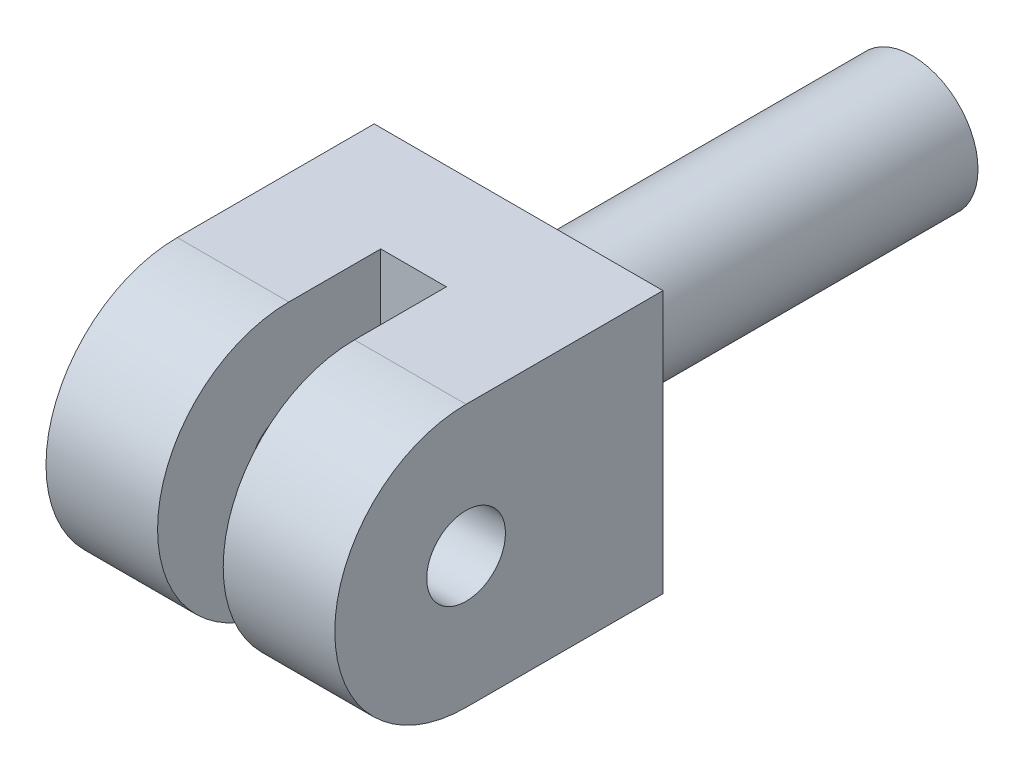
ISO-10303-21;
HEADER;
FILE_DESCRIPTION(('STEP AP214'),'2;1');
FILE_NAME('part.step','',(''),(''),'','','');
FILE_SCHEMA(('AUTOMOTIVE_DESIGN { 1 0 10303 214 1 1 1 1 }'));
ENDSEC;
DATA;
#1=APPLICATION_CONTEXT('core data for automotive mechanical design processes');
#2=APPLICATION_PROTOCOL_DEFINITION('international standard','automotive_design',2000,#1);
#3=PRODUCT_CONTEXT('',#1,'mechanical');
#4=PRODUCT('Part','Part','',(#3));
#5=PRODUCT_RELATED_PRODUCT_CATEGORY('part','',(#4));
#6=PRODUCT_DEFINITION_FORMATION('','',#4);
#7=PRODUCT_DEFINITION_CONTEXT('part definition',#1,'design');
#8=PRODUCT_DEFINITION('design','',#6,#7);
#9=PRODUCT_DEFINITION_SHAPE('','',#8);
#10=(LENGTH_UNIT() NAMED_UNIT(*) SI_UNIT(.MILLI.,.METRE.));
#11=(NAMED_UNIT(*) PLANE_ANGLE_UNIT() SI_UNIT($,.RADIAN.));
#12=(NAMED_UNIT(*) SI_UNIT($,.STERADIAN.) SOLID_ANGLE_UNIT());
#13=UNCERTAINTY_MEASURE_WITH_UNIT(LENGTH_MEASURE(1.E-05),#10,'distance_accuracy_value','');
#14=(GEOMETRIC_REPRESENTATION_CONTEXT(3) GLOBAL_UNCERTAINTY_ASSIGNED_CONTEXT((#13)) GLOBAL_UNIT_ASSIGNED_CONTEXT((#10,
#11,#12)) REPRESENTATION_CONTEXT('',''));
#15=CARTESIAN_POINT('',(0.,0.,0.));
#16=DIRECTION('',(0.,0.,1.));
#17=DIRECTION('',(1.,0.,0.));
#18=AXIS2_PLACEMENT_3D('',#15,#16,#17);
#19=CARTESIAN_POINT('',(0.,10.,-10.));
#20=DIRECTION('',(-1.,0.,0.));
#21=DIRECTION('',(0.,0.,1.));
#22=AXIS2_PLACEMENT_3D('',#19,#20,#21);
#23=CYLINDRICAL_SURFACE('',#22,10.);
#24=CARTESIAN_POINT('',(13.5,10.,-10.));
#25=DIRECTION('',(1.,0.,0.));
#26=DIRECTION('',(0.,0.,-1.));
#27=AXIS2_PLACEMENT_3D('',#24,#25,#26);
#28=CIRCLE('',#27,10.);
#29=CARTESIAN_POINT('',(13.5,0.,-10.));
#30=VERTEX_POINT('',#29);
#31=CARTESIAN_POINT('',(13.5,20.,-10.));
#32=VERTEX_POINT('',#31);
#33=EDGE_CURVE('E133',#30,#32,#28,.F.);
#34=ORIENTED_EDGE('',*,*,#33,.F.);
#35=DIRECTION('',(-1.,0.,0.));
#36=VECTOR('',#35,1.);
#37=CARTESIAN_POINT('',(22.,0.,-10.));
#38=LINE('',#37,#36);
#39=CARTESIAN_POINT('',(22.,0.,-10.));
#40=VERTEX_POINT('',#39);
#41=EDGE_CURVE('E165',#40,#30,#38,.T.);
#42=ORIENTED_EDGE('',*,*,#41,.F.);
#43=CARTESIAN_POINT('',(22.,10.,-10.));
#44=DIRECTION('',(-1.,0.,0.));
#45=DIRECTION('',(0.,0.,1.));
#46=AXIS2_PLACEMENT_3D('',#43,#44,#45);
#47=CIRCLE('',#46,10.);
#48=CARTESIAN_POINT('',(22.,20.,-10.));
#49=VERTEX_POINT('',#48);
#50=EDGE_CURVE('E41',#49,#40,#47,.F.);
#51=ORIENTED_EDGE('',*,*,#50,.F.);
#52=DIRECTION('',(-1.,0.,0.));
#53=VECTOR('',#52,1.);
#54=CARTESIAN_POINT('',(22.,20.,-10.));
#55=LINE('',#54,#53);
#56=EDGE_CURVE('E162',#32,#49,#55,.F.);
#57=ORIENTED_EDGE('',*,*,#56,.F.);
#58=EDGE_LOOP('',(#34,#42,#51,#57));
#59=FACE_BOUND('',#58,.T.);
#60=ADVANCED_FACE('F32',(#59),#23,.T.);
#61=CARTESIAN_POINT('',(-8.,10.,-10.));
#62=DIRECTION('',(1.,0.,0.));
#63=DIRECTION('',(0.,0.,-1.));
#64=AXIS2_PLACEMENT_3D('',#61,#62,#63);
#65=CYLINDRICAL_SURFACE('',#64,3.);
#66=CARTESIAN_POINT('',(13.5,10.,-10.));
#67=DIRECTION('',(1.,0.,0.));
#68=DIRECTION('',(0.,0.,-1.));
#69=AXIS2_PLACEMENT_3D('',#66,#67,#68);
#70=CIRCLE('',#69,3.);
#71=CARTESIAN_POINT('',(13.5,10.,-13.));
#72=VERTEX_POINT('',#71);
#73=EDGE_CURVE('E36',#72,#72,#70,.F.);
#74=ORIENTED_EDGE('',*,*,#73,.T.);
#75=EDGE_LOOP('',(#74));
#76=FACE_BOUND('',#75,.T.);
#77=CARTESIAN_POINT('',(22.,10.,-10.));
#78=DIRECTION('',(1.,0.,0.));
#79=DIRECTION('',(0.,0.,-1.));
#80=AXIS2_PLACEMENT_3D('',#77,#78,#79);
#81=CIRCLE('',#80,3.);
#82=CARTESIAN_POINT('',(22.,10.,-13.));
#83=VERTEX_POINT('',#82);
#84=EDGE_CURVE('E137',#83,#83,#81,.T.);
#85=ORIENTED_EDGE('',*,*,#84,.T.);
#86=EDGE_LOOP('',(#85));
#87=FACE_BOUND('',#86,.T.);
#88=ADVANCED_FACE('F186',(#76,#87),#65,.F.);
#89=CARTESIAN_POINT('',(22.,0.,-25.));
#90=DIRECTION('',(0.,0.,1.));
#91=DIRECTION('',(1.,0.,0.));
#92=AXIS2_PLACEMENT_3D('',#89,#90,#91);
#93=PLANE('',#92);
#94=DIRECTION('',(0.,1.,0.));
#95=VECTOR('',#94,1.);
#96=CARTESIAN_POINT('',(0.,0.,-25.));
#97=LINE('',#96,#95);
#98=CARTESIAN_POINT('',(0.,0.,-25.));
#99=VERTEX_POINT('',#98);
#100=CARTESIAN_POINT('',(0.,20.,-25.));
#101=VERTEX_POINT('',#100);
#102=EDGE_CURVE('E154',#99,#101,#97,.T.);
#103=ORIENTED_EDGE('',*,*,#102,.T.);
#104=DIRECTION('',(-1.,0.,0.));
#105=VECTOR('',#104,1.);
#106=CARTESIAN_POINT('',(22.,20.,-25.));
#107=LINE('',#106,#105);
#108=CARTESIAN_POINT('',(22.,20.,-25.));
#109=VERTEX_POINT('',#108);
#110=EDGE_CURVE('E152',#109,#101,#107,.T.);
#111=ORIENTED_EDGE('',*,*,#110,.F.);
#112=DIRECTION('',(0.,1.,0.));
#113=VECTOR('',#112,1.);
#114=CARTESIAN_POINT('',(22.,0.,-25.));
#115=LINE('',#114,#113);
#116=CARTESIAN_POINT('',(22.,0.,-25.));
#117=VERTEX_POINT('',#116);
#118=EDGE_CURVE('E147',#117,#109,#115,.T.);
#119=ORIENTED_EDGE('',*,*,#118,.F.);
#120=DIRECTION('',(-1.,0.,0.));
#121=VECTOR('',#120,1.);
#122=CARTESIAN_POINT('',(22.,0.,-25.));
#123=LINE('',#122,#121);
#124=EDGE_CURVE('E159',#117,#99,#123,.T.);
#125=ORIENTED_EDGE('',*,*,#124,.T.);
#126=EDGE_LOOP('',(#103,#111,#119,#125));
#127=FACE_BOUND('',#126,.T.);
#128=CARTESIAN_POINT('',(11.,10.,-25.));
#129=DIRECTION('',(0.,0.,1.));
#130=DIRECTION('',(1.,0.,0.));
#131=AXIS2_PLACEMENT_3D('',#128,#129,#130);
#132=CIRCLE('',#131,5.);
#133=CARTESIAN_POINT('',(16.,10.,-25.));
#134=VERTEX_POINT('',#133);
#135=EDGE_CURVE('E11',#134,#134,#132,.F.);
#136=ORIENTED_EDGE('',*,*,#135,.F.);
#137=EDGE_LOOP('',(#136));
#138=FACE_BOUND('',#137,.T.);
#139=ADVANCED_FACE('F191',(#127,#138),#93,.F.);
#140=CARTESIAN_POINT('',(8.5,10.,-10.));
#141=DIRECTION('',(-1.,0.,0.));
#142=DIRECTION('',(0.,0.,1.));
#143=AXIS2_PLACEMENT_3D('',#140,#141,#142);
#144=CIRCLE('',#143,10.);
#145=CARTESIAN_POINT('',(8.5,20.,-10.));
#146=VERTEX_POINT('',#145);
#147=CARTESIAN_POINT('',(8.5,0.,-10.));
#148=VERTEX_POINT('',#147);
#149=EDGE_CURVE('E128',#146,#148,#144,.F.);
#150=ORIENTED_EDGE('',*,*,#149,.F.);
#151=CARTESIAN_POINT('',(0.,20.,-10.));
#152=VERTEX_POINT('',#151);
#153=EDGE_CURVE('E122',#152,#146,#55,.F.);
#154=ORIENTED_EDGE('',*,*,#153,.F.);
#155=CARTESIAN_POINT('',(0.,10.,-10.));
#156=DIRECTION('',(-1.,0.,0.));
#157=DIRECTION('',(0.,0.,1.));
#158=AXIS2_PLACEMENT_3D('',#155,#156,#157);
#159=CIRCLE('',#158,10.);
#160=CARTESIAN_POINT('',(0.,0.,-10.));
#161=VERTEX_POINT('',#160);
#162=EDGE_CURVE('E168',#161,#152,#159,.T.);
#163=ORIENTED_EDGE('',*,*,#162,.F.);
#164=EDGE_CURVE('E164',#148,#161,#38,.T.);
#165=ORIENTED_EDGE('',*,*,#164,.F.);
#166=EDGE_LOOP('',(#150,#154,#163,#165));
#167=FACE_BOUND('',#166,.T.);
#168=ADVANCED_FACE('F34',(#167),#23,.T.);
#169=CARTESIAN_POINT('',(22.,0.,0.));
#170=DIRECTION('',(0.,1.,0.));
#171=DIRECTION('',(0.,0.,1.));
#172=AXIS2_PLACEMENT_3D('',#169,#170,#171);
#173=PLANE('',#172);
#174=ORIENTED_EDGE('',*,*,#41,.T.);
#175=DIRECTION('',(0.,0.,-1.));
#176=VECTOR('',#175,1.);
#177=CARTESIAN_POINT('',(13.5,0.,0.));
#178=LINE('',#177,#176);
#179=CARTESIAN_POINT('',(13.5,0.,-17.));
#180=VERTEX_POINT('',#179);
#181=EDGE_CURVE('E130',#30,#180,#178,.T.);
#182=ORIENTED_EDGE('',*,*,#181,.T.);
#183=DIRECTION('',(-1.,0.,0.));
#184=VECTOR('',#183,1.);
#185=CARTESIAN_POINT('',(22.,0.,-17.));
#186=LINE('',#185,#184);
#187=CARTESIAN_POINT('',(8.5,0.,-17.));
#188=VERTEX_POINT('',#187);
#189=EDGE_CURVE('E135',#180,#188,#186,.T.);
#190=ORIENTED_EDGE('',*,*,#189,.T.);
#191=DIRECTION('',(0.,0.,1.));
#192=VECTOR('',#191,1.);
#193=CARTESIAN_POINT('',(8.5,0.,0.));
#194=LINE('',#193,#192);
#195=EDGE_CURVE('E107',#188,#148,#194,.T.);
#196=ORIENTED_EDGE('',*,*,#195,.T.);
#197=ORIENTED_EDGE('',*,*,#164,.T.);
#198=DIRECTION('',(0.,0.,-1.));
#199=VECTOR('',#198,1.);
#200=CARTESIAN_POINT('',(0.,0.,0.));
#201=LINE('',#200,#199);
#202=EDGE_CURVE('E144',#161,#99,#201,.T.);
#203=ORIENTED_EDGE('',*,*,#202,.T.);
#204=ORIENTED_EDGE('',*,*,#124,.F.);
#205=DIRECTION('',(0.,0.,-1.));
#206=VECTOR('',#205,1.);
#207=CARTESIAN_POINT('',(22.,0.,0.));
#208=LINE('',#207,#206);
#209=EDGE_CURVE('E145',#40,#117,#208,.T.);
#210=ORIENTED_EDGE('',*,*,#209,.F.);
#211=EDGE_LOOP('',(#174,#182,#190,#196,#197,#203,#204,#210));
#212=FACE_BOUND('',#211,.T.);
#213=ADVANCED_FACE('F196',(#212),#173,.F.);
#214=CARTESIAN_POINT('',(22.,20.,0.));
#215=DIRECTION('',(0.,-1.,0.));
#216=DIRECTION('',(0.,0.,-1.));
#217=AXIS2_PLACEMENT_3D('',#214,#215,#216);
#218=PLANE('',#217);
#219=DIRECTION('',(-1.,0.,0.));
#220=VECTOR('',#219,1.);
#221=CARTESIAN_POINT('',(8.5,20.,-17.));
#222=LINE('',#221,#220);
#223=CARTESIAN_POINT('',(13.5,20.,-17.));
#224=VERTEX_POINT('',#223);
#225=CARTESIAN_POINT('',(8.5,20.,-17.));
#226=VERTEX_POINT('',#225);
#227=EDGE_CURVE('E114',#224,#226,#222,.T.);
#228=ORIENTED_EDGE('',*,*,#227,.F.);
#229=DIRECTION('',(0.,0.,-1.));
#230=VECTOR('',#229,1.);
#231=CARTESIAN_POINT('',(13.5,20.,17.));
#232=LINE('',#231,#230);
#233=EDGE_CURVE('E49',#32,#224,#232,.T.);
#234=ORIENTED_EDGE('',*,*,#233,.F.);
#235=ORIENTED_EDGE('',*,*,#56,.T.);
#236=DIRECTION('',(0.,0.,1.));
#237=VECTOR('',#236,1.);
#238=CARTESIAN_POINT('',(22.,20.,0.));
#239=LINE('',#238,#237);
#240=EDGE_CURVE('E150',#109,#49,#239,.T.);
#241=ORIENTED_EDGE('',*,*,#240,.F.);
#242=ORIENTED_EDGE('',*,*,#110,.T.);
#243=DIRECTION('',(0.,0.,1.));
#244=VECTOR('',#243,1.);
#245=CARTESIAN_POINT('',(0.,20.,0.));
#246=LINE('',#245,#244);
#247=EDGE_CURVE('E148',#101,#152,#246,.T.);
#248=ORIENTED_EDGE('',*,*,#247,.T.);
#249=ORIENTED_EDGE('',*,*,#153,.T.);
#250=DIRECTION('',(0.,0.,1.));
#251=VECTOR('',#250,1.);
#252=CARTESIAN_POINT('',(8.5,20.,17.));
#253=LINE('',#252,#251);
#254=EDGE_CURVE('E104',#226,#146,#253,.T.);
#255=ORIENTED_EDGE('',*,*,#254,.F.);
#256=EDGE_LOOP('',(#228,#234,#235,#241,#242,#248,#249,#255));
#257=FACE_BOUND('',#256,.T.);
#258=ADVANCED_FACE('F119',(#257),#218,.F.);
#259=CARTESIAN_POINT('',(22.,0.,0.));
#260=DIRECTION('',(-1.,0.,0.));
#261=DIRECTION('',(0.,0.,1.));
#262=AXIS2_PLACEMENT_3D('',#259,#260,#261);
#263=PLANE('',#262);
#264=ORIENTED_EDGE('',*,*,#84,.F.);
#265=EDGE_LOOP('',(#264));
#266=FACE_BOUND('',#265,.T.);
#267=ORIENTED_EDGE('',*,*,#240,.T.);
#268=ORIENTED_EDGE('',*,*,#50,.T.);
#269=ORIENTED_EDGE('',*,*,#209,.T.);
#270=ORIENTED_EDGE('',*,*,#118,.T.);
#271=EDGE_LOOP('',(#267,#268,#269,#270));
#272=FACE_BOUND('',#271,.T.);
#273=ADVANCED_FACE('F212',(#266,#272),#263,.F.);
#274=CARTESIAN_POINT('',(0.,0.,0.));
#275=DIRECTION('',(-1.,0.,0.));
#276=DIRECTION('',(0.,0.,1.));
#277=AXIS2_PLACEMENT_3D('',#274,#275,#276);
#278=PLANE('',#277);
#279=CARTESIAN_POINT('',(0.,10.,-10.));
#280=DIRECTION('',(-1.,0.,0.));
#281=DIRECTION('',(0.,0.,1.));
#282=AXIS2_PLACEMENT_3D('',#279,#280,#281);
#283=CIRCLE('',#282,3.);
#284=CARTESIAN_POINT('',(0.,10.,-7.));
#285=VERTEX_POINT('',#284);
#286=EDGE_CURVE('E140',#285,#285,#283,.T.);
#287=ORIENTED_EDGE('',*,*,#286,.F.);
#288=EDGE_LOOP('',(#287));
#289=FACE_BOUND('',#288,.T.);
#290=ORIENTED_EDGE('',*,*,#202,.F.);
#291=ORIENTED_EDGE('',*,*,#162,.T.);
#292=ORIENTED_EDGE('',*,*,#247,.F.);
#293=ORIENTED_EDGE('',*,*,#102,.F.);
#294=EDGE_LOOP('',(#290,#291,#292,#293));
#295=FACE_BOUND('',#294,.T.);
#296=ADVANCED_FACE('F220',(#289,#295),#278,.T.);
#297=CARTESIAN_POINT('',(11.,10.,-55.));
#298=DIRECTION('',(0.,0.,1.));
#299=DIRECTION('',(1.,0.,0.));
#300=AXIS2_PLACEMENT_3D('',#297,#298,#299);
#301=CYLINDRICAL_SURFACE('',#300,5.);
#302=CARTESIAN_POINT('',(11.,10.,-55.));
#303=DIRECTION('',(0.,0.,-1.));
#304=DIRECTION('',(-1.,0.,0.));
#305=AXIS2_PLACEMENT_3D('',#302,#303,#304);
#306=CIRCLE('',#305,5.);
#307=CARTESIAN_POINT('',(6.,10.,-55.));
#308=VERTEX_POINT('',#307);
#309=EDGE_CURVE('E141',#308,#308,#306,.T.);
#310=ORIENTED_EDGE('',*,*,#309,.F.);
#311=EDGE_LOOP('',(#310));
#312=FACE_BOUND('',#311,.T.);
#313=ORIENTED_EDGE('',*,*,#135,.T.);
#314=EDGE_LOOP('',(#313));
#315=FACE_BOUND('',#314,.T.);
#316=ADVANCED_FACE('F222',(#312,#315),#301,.T.);
#317=CARTESIAN_POINT('',(11.,10.,-55.));
#318=DIRECTION('',(0.,0.,-1.));
#319=DIRECTION('',(-1.,0.,0.));
#320=AXIS2_PLACEMENT_3D('',#317,#318,#319);
#321=PLANE('',#320);
#322=ORIENTED_EDGE('',*,*,#309,.T.);
#323=EDGE_LOOP('',(#322));
#324=FACE_BOUND('',#323,.T.);
#325=ADVANCED_FACE('F229',(#324),#321,.T.);
#326=CARTESIAN_POINT('',(8.5,10.,-10.));
#327=DIRECTION('',(-1.,0.,0.));
#328=DIRECTION('',(0.,0.,1.));
#329=AXIS2_PLACEMENT_3D('',#326,#327,#328);
#330=CIRCLE('',#329,3.);
#331=CARTESIAN_POINT('',(8.5,10.,-7.));
#332=VERTEX_POINT('',#331);
#333=EDGE_CURVE('E110',#332,#332,#330,.F.);
#334=ORIENTED_EDGE('',*,*,#333,.T.);
#335=EDGE_LOOP('',(#334));
#336=FACE_BOUND('',#335,.T.);
#337=ORIENTED_EDGE('',*,*,#286,.T.);
#338=EDGE_LOOP('',(#337));
#339=FACE_BOUND('',#338,.T.);
#340=ADVANCED_FACE('F175',(#336,#339),#65,.F.);
#341=CARTESIAN_POINT('',(8.5,-11.,-17.));
#342=DIRECTION('',(0.,0.,-1.));
#343=DIRECTION('',(-1.,0.,0.));
#344=AXIS2_PLACEMENT_3D('',#341,#342,#343);
#345=PLANE('',#344);
#346=DIRECTION('',(0.,1.,0.));
#347=VECTOR('',#346,1.);
#348=CARTESIAN_POINT('',(13.5,-11.,-17.));
#349=LINE('',#348,#347);
#350=EDGE_CURVE('E111',#180,#224,#349,.T.);
#351=ORIENTED_EDGE('',*,*,#350,.T.);
#352=ORIENTED_EDGE('',*,*,#227,.T.);
#353=DIRECTION('',(0.,1.,0.));
#354=VECTOR('',#353,1.);
#355=CARTESIAN_POINT('',(8.5,-11.,-17.));
#356=LINE('',#355,#354);
#357=EDGE_CURVE('E99',#188,#226,#356,.T.);
#358=ORIENTED_EDGE('',*,*,#357,.F.);
#359=ORIENTED_EDGE('',*,*,#189,.F.);
#360=EDGE_LOOP('',(#351,#352,#358,#359));
#361=FACE_BOUND('',#360,.T.);
#362=ADVANCED_FACE('F115',(#361),#345,.F.);
#363=CARTESIAN_POINT('',(13.5,-11.,17.));
#364=DIRECTION('',(1.,0.,0.));
#365=DIRECTION('',(0.,0.,-1.));
#366=AXIS2_PLACEMENT_3D('',#363,#364,#365);
#367=PLANE('',#366);
#368=ORIENTED_EDGE('',*,*,#33,.T.);
#369=ORIENTED_EDGE('',*,*,#233,.T.);
#370=ORIENTED_EDGE('',*,*,#350,.F.);
#371=ORIENTED_EDGE('',*,*,#181,.F.);
#372=EDGE_LOOP('',(#368,#369,#370,#371));
#373=FACE_BOUND('',#372,.T.);
#374=ORIENTED_EDGE('',*,*,#73,.F.);
#375=EDGE_LOOP('',(#374));
#376=FACE_BOUND('',#375,.T.);
#377=ADVANCED_FACE('F178',(#373,#376),#367,.F.);
#378=CARTESIAN_POINT('',(8.5,-11.,17.));
#379=DIRECTION('',(-1.,0.,0.));
#380=DIRECTION('',(0.,0.,1.));
#381=AXIS2_PLACEMENT_3D('',#378,#379,#380);
#382=PLANE('',#381);
#383=ORIENTED_EDGE('',*,*,#149,.T.);
#384=ORIENTED_EDGE('',*,*,#195,.F.);
#385=ORIENTED_EDGE('',*,*,#357,.T.);
#386=ORIENTED_EDGE('',*,*,#254,.T.);
#387=EDGE_LOOP('',(#383,#384,#385,#386));
#388=FACE_BOUND('',#387,.T.);
#389=ORIENTED_EDGE('',*,*,#333,.F.);
#390=EDGE_LOOP('',(#389));
#391=FACE_BOUND('',#390,.T.);
#392=ADVANCED_FACE('F101',(#388,#391),#382,.F.);
#393=CLOSED_SHELL('',(#60,#88,#139,#168,#213,#258,#273,#296,#316,#325,#340,#362,#377,#392));
#394=MANIFOLD_SOLID_BREP('B2',#393);
#395=ADVANCED_BREP_SHAPE_REPRESENTATION('',(#18,#394),#14);
#396=SHAPE_DEFINITION_REPRESENTATION(#9,#395);
ENDSEC;
END-ISO-10303-21;
